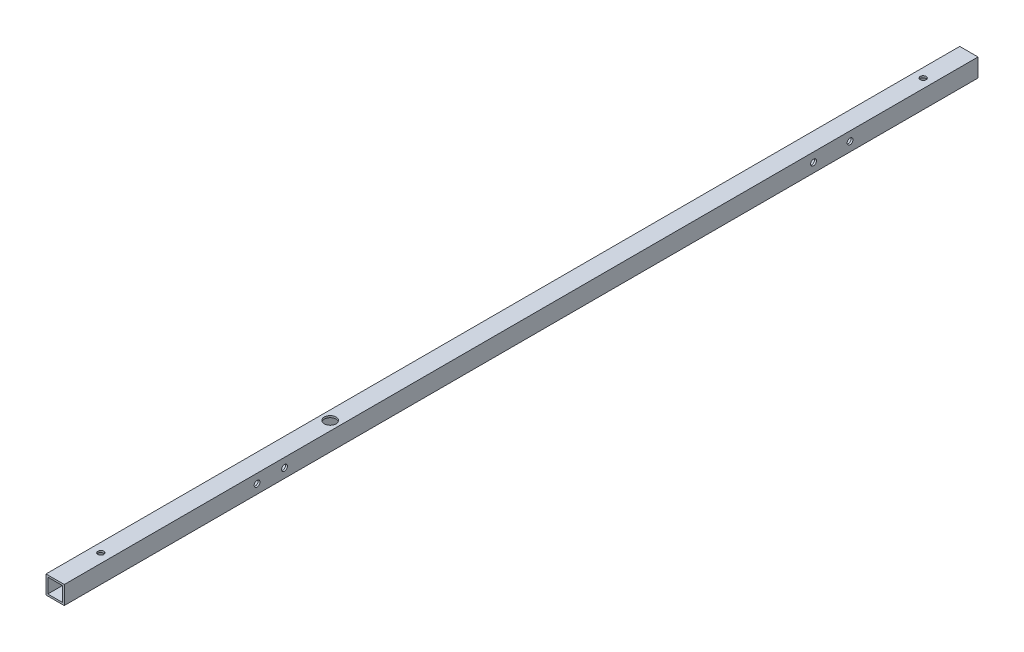
ISO-10303-21;
HEADER;
FILE_DESCRIPTION(('STEP AP214'),'2;1');
FILE_NAME('part.step','',(''),(''),'','','');
FILE_SCHEMA(('AUTOMOTIVE_DESIGN { 1 0 10303 214 1 1 1 1 }'));
ENDSEC;
DATA;
#1=APPLICATION_CONTEXT('core data for automotive mechanical design processes');
#2=APPLICATION_PROTOCOL_DEFINITION('international standard','automotive_design',2000,#1);
#3=PRODUCT_CONTEXT('',#1,'mechanical');
#4=PRODUCT('Part','Part','',(#3));
#5=PRODUCT_RELATED_PRODUCT_CATEGORY('part','',(#4));
#6=PRODUCT_DEFINITION_FORMATION('','',#4);
#7=PRODUCT_DEFINITION_CONTEXT('part definition',#1,'design');
#8=PRODUCT_DEFINITION('design','',#6,#7);
#9=PRODUCT_DEFINITION_SHAPE('','',#8);
#10=(LENGTH_UNIT() NAMED_UNIT(*) SI_UNIT(.MILLI.,.METRE.));
#11=(NAMED_UNIT(*) PLANE_ANGLE_UNIT() SI_UNIT($,.RADIAN.));
#12=(NAMED_UNIT(*) SI_UNIT($,.STERADIAN.) SOLID_ANGLE_UNIT());
#13=UNCERTAINTY_MEASURE_WITH_UNIT(LENGTH_MEASURE(1.E-05),#10,'distance_accuracy_value','');
#14=(GEOMETRIC_REPRESENTATION_CONTEXT(3) GLOBAL_UNCERTAINTY_ASSIGNED_CONTEXT((#13)) GLOBAL_UNIT_ASSIGNED_CONTEXT((#10,
#11,#12)) REPRESENTATION_CONTEXT('',''));
#15=CARTESIAN_POINT('',(0.,0.,0.));
#16=DIRECTION('',(0.,0.,1.));
#17=DIRECTION('',(1.,0.,0.));
#18=AXIS2_PLACEMENT_3D('',#15,#16,#17);
#19=CARTESIAN_POINT('',(0.,0.,500.));
#20=DIRECTION('',(0.,0.,1.));
#21=DIRECTION('',(1.,0.,0.));
#22=AXIS2_PLACEMENT_3D('',#19,#20,#21);
#23=PLANE('',#22);
#24=DIRECTION('',(0.,1.,0.));
#25=VECTOR('',#24,1.);
#26=CARTESIAN_POINT('',(5.,5.,500.));
#27=LINE('',#26,#25);
#28=CARTESIAN_POINT('',(5.,-5.,500.));
#29=VERTEX_POINT('',#28);
#30=CARTESIAN_POINT('',(5.,5.,500.));
#31=VERTEX_POINT('',#30);
#32=EDGE_CURVE('E138',#29,#31,#27,.T.);
#33=ORIENTED_EDGE('',*,*,#32,.T.);
#34=DIRECTION('',(-1.,0.,0.));
#35=VECTOR('',#34,1.);
#36=CARTESIAN_POINT('',(-5.,5.,500.));
#37=LINE('',#36,#35);
#38=CARTESIAN_POINT('',(-5.,5.,500.));
#39=VERTEX_POINT('',#38);
#40=EDGE_CURVE('E141',#31,#39,#37,.T.);
#41=ORIENTED_EDGE('',*,*,#40,.T.);
#42=DIRECTION('',(0.,-1.,0.));
#43=VECTOR('',#42,1.);
#44=CARTESIAN_POINT('',(-5.,5.,500.));
#45=LINE('',#44,#43);
#46=CARTESIAN_POINT('',(-5.,-5.,500.));
#47=VERTEX_POINT('',#46);
#48=EDGE_CURVE('E144',#39,#47,#45,.T.);
#49=ORIENTED_EDGE('',*,*,#48,.T.);
#50=DIRECTION('',(1.,0.,0.));
#51=VECTOR('',#50,1.);
#52=CARTESIAN_POINT('',(-5.,-5.,500.));
#53=LINE('',#52,#51);
#54=EDGE_CURVE('E146',#47,#29,#53,.T.);
#55=ORIENTED_EDGE('',*,*,#54,.T.);
#56=EDGE_LOOP('',(#33,#41,#49,#55));
#57=FACE_BOUND('',#56,.T.);
#58=DIRECTION('',(-1.,0.,0.));
#59=VECTOR('',#58,1.);
#60=CARTESIAN_POINT('',(-4.,4.,500.));
#61=LINE('',#60,#59);
#62=CARTESIAN_POINT('',(4.,4.,500.));
#63=VERTEX_POINT('',#62);
#64=CARTESIAN_POINT('',(-4.,4.,500.));
#65=VERTEX_POINT('',#64);
#66=EDGE_CURVE('E108',#63,#65,#61,.T.);
#67=ORIENTED_EDGE('',*,*,#66,.F.);
#68=DIRECTION('',(0.,1.,0.));
#69=VECTOR('',#68,1.);
#70=CARTESIAN_POINT('',(4.,4.,500.));
#71=LINE('',#70,#69);
#72=CARTESIAN_POINT('',(4.,-4.,500.));
#73=VERTEX_POINT('',#72);
#74=EDGE_CURVE('E100',#73,#63,#71,.T.);
#75=ORIENTED_EDGE('',*,*,#74,.F.);
#76=DIRECTION('',(1.,0.,0.));
#77=VECTOR('',#76,1.);
#78=CARTESIAN_POINT('',(-4.,-4.,500.));
#79=LINE('',#78,#77);
#80=CARTESIAN_POINT('',(-4.,-4.,500.));
#81=VERTEX_POINT('',#80);
#82=EDGE_CURVE('E122',#81,#73,#79,.T.);
#83=ORIENTED_EDGE('',*,*,#82,.F.);
#84=DIRECTION('',(0.,-1.,0.));
#85=VECTOR('',#84,1.);
#86=CARTESIAN_POINT('',(-4.,4.,500.));
#87=LINE('',#86,#85);
#88=EDGE_CURVE('E120',#65,#81,#87,.T.);
#89=ORIENTED_EDGE('',*,*,#88,.F.);
#90=EDGE_LOOP('',(#67,#75,#83,#89));
#91=FACE_BOUND('',#90,.T.);
#92=ADVANCED_FACE('F33',(#57,#91),#23,.T.);
#93=CARTESIAN_POINT('',(0.,0.,0.));
#94=DIRECTION('',(0.,0.,1.));
#95=DIRECTION('',(1.,0.,0.));
#96=AXIS2_PLACEMENT_3D('',#93,#94,#95);
#97=PLANE('',#96);
#98=DIRECTION('',(0.,1.,0.));
#99=VECTOR('',#98,1.);
#100=CARTESIAN_POINT('',(5.,5.,0.));
#101=LINE('',#100,#99);
#102=CARTESIAN_POINT('',(5.,-5.,0.));
#103=VERTEX_POINT('',#102);
#104=CARTESIAN_POINT('',(5.,5.,0.));
#105=VERTEX_POINT('',#104);
#106=EDGE_CURVE('E116',#103,#105,#101,.T.);
#107=ORIENTED_EDGE('',*,*,#106,.F.);
#108=DIRECTION('',(1.,0.,0.));
#109=VECTOR('',#108,1.);
#110=CARTESIAN_POINT('',(-5.,-5.,0.));
#111=LINE('',#110,#109);
#112=CARTESIAN_POINT('',(-5.,-5.,0.));
#113=VERTEX_POINT('',#112);
#114=EDGE_CURVE('E142',#113,#103,#111,.T.);
#115=ORIENTED_EDGE('',*,*,#114,.F.);
#116=DIRECTION('',(0.,-1.,0.));
#117=VECTOR('',#116,1.);
#118=CARTESIAN_POINT('',(-5.,5.,0.));
#119=LINE('',#118,#117);
#120=CARTESIAN_POINT('',(-5.,5.,0.));
#121=VERTEX_POINT('',#120);
#122=EDGE_CURVE('E153',#121,#113,#119,.T.);
#123=ORIENTED_EDGE('',*,*,#122,.F.);
#124=DIRECTION('',(-1.,0.,0.));
#125=VECTOR('',#124,1.);
#126=CARTESIAN_POINT('',(-5.,5.,0.));
#127=LINE('',#126,#125);
#128=EDGE_CURVE('E151',#105,#121,#127,.T.);
#129=ORIENTED_EDGE('',*,*,#128,.F.);
#130=EDGE_LOOP('',(#107,#115,#123,#129));
#131=FACE_BOUND('',#130,.T.);
#132=DIRECTION('',(0.,1.,0.));
#133=VECTOR('',#132,1.);
#134=CARTESIAN_POINT('',(4.,4.,0.));
#135=LINE('',#134,#133);
#136=CARTESIAN_POINT('',(4.,-4.,0.));
#137=VERTEX_POINT('',#136);
#138=CARTESIAN_POINT('',(4.,4.,0.));
#139=VERTEX_POINT('',#138);
#140=EDGE_CURVE('E58',#137,#139,#135,.T.);
#141=ORIENTED_EDGE('',*,*,#140,.T.);
#142=DIRECTION('',(-1.,0.,0.));
#143=VECTOR('',#142,1.);
#144=CARTESIAN_POINT('',(-4.,4.,0.));
#145=LINE('',#144,#143);
#146=CARTESIAN_POINT('',(-4.,4.,0.));
#147=VERTEX_POINT('',#146);
#148=EDGE_CURVE('E115',#139,#147,#145,.T.);
#149=ORIENTED_EDGE('',*,*,#148,.T.);
#150=DIRECTION('',(0.,-1.,0.));
#151=VECTOR('',#150,1.);
#152=CARTESIAN_POINT('',(-4.,4.,0.));
#153=LINE('',#152,#151);
#154=CARTESIAN_POINT('',(-4.,-4.,0.));
#155=VERTEX_POINT('',#154);
#156=EDGE_CURVE('E130',#147,#155,#153,.T.);
#157=ORIENTED_EDGE('',*,*,#156,.T.);
#158=DIRECTION('',(1.,0.,0.));
#159=VECTOR('',#158,1.);
#160=CARTESIAN_POINT('',(-4.,-4.,0.));
#161=LINE('',#160,#159);
#162=EDGE_CURVE('E109',#155,#137,#161,.T.);
#163=ORIENTED_EDGE('',*,*,#162,.T.);
#164=EDGE_LOOP('',(#141,#149,#157,#163));
#165=FACE_BOUND('',#164,.T.);
#166=ADVANCED_FACE('F235',(#131,#165),#97,.F.);
#167=CARTESIAN_POINT('',(5.,5.,500.));
#168=DIRECTION('',(-1.,0.,0.));
#169=DIRECTION('',(0.,-1.,0.));
#170=AXIS2_PLACEMENT_3D('',#167,#168,#169);
#171=PLANE('',#170);
#172=CARTESIAN_POINT('',(5.,0.,70.));
#173=DIRECTION('',(1.,0.,0.));
#174=DIRECTION('',(0.,1.,0.));
#175=AXIS2_PLACEMENT_3D('',#172,#173,#174);
#176=CIRCLE('',#175,1.60000000000001);
#177=CARTESIAN_POINT('',(5.,1.60000000000001,70.));
#178=VERTEX_POINT('',#177);
#179=EDGE_CURVE('E324',#178,#178,#176,.T.);
#180=ORIENTED_EDGE('',*,*,#179,.F.);
#181=EDGE_LOOP('',(#180));
#182=FACE_BOUND('',#181,.T.);
#183=CARTESIAN_POINT('',(5.,0.,379.5));
#184=DIRECTION('',(1.,0.,0.));
#185=DIRECTION('',(0.,1.,0.));
#186=AXIS2_PLACEMENT_3D('',#183,#184,#185);
#187=CIRCLE('',#186,1.59999999999996);
#188=CARTESIAN_POINT('',(5.,1.59999999999997,379.5));
#189=VERTEX_POINT('',#188);
#190=EDGE_CURVE('E320',#189,#189,#187,.T.);
#191=ORIENTED_EDGE('',*,*,#190,.F.);
#192=EDGE_LOOP('',(#191));
#193=FACE_BOUND('',#192,.T.);
#194=CARTESIAN_POINT('',(5.,0.,394.5));
#195=DIRECTION('',(1.,0.,0.));
#196=DIRECTION('',(0.,1.,0.));
#197=AXIS2_PLACEMENT_3D('',#194,#195,#196);
#198=CIRCLE('',#197,1.59999999999996);
#199=CARTESIAN_POINT('',(5.,1.59999999999997,394.5));
#200=VERTEX_POINT('',#199);
#201=EDGE_CURVE('E331',#200,#200,#198,.T.);
#202=ORIENTED_EDGE('',*,*,#201,.F.);
#203=EDGE_LOOP('',(#202));
#204=FACE_BOUND('',#203,.T.);
#205=CARTESIAN_POINT('',(5.,0.,90.));
#206=DIRECTION('',(1.,0.,0.));
#207=DIRECTION('',(0.,1.,0.));
#208=AXIS2_PLACEMENT_3D('',#205,#206,#207);
#209=CIRCLE('',#208,1.60000000000001);
#210=CARTESIAN_POINT('',(5.,1.60000000000001,90.));
#211=VERTEX_POINT('',#210);
#212=EDGE_CURVE('E336',#211,#211,#209,.T.);
#213=ORIENTED_EDGE('',*,*,#212,.F.);
#214=EDGE_LOOP('',(#213));
#215=FACE_BOUND('',#214,.T.);
#216=ORIENTED_EDGE('',*,*,#106,.T.);
#217=DIRECTION('',(0.,0.,-1.));
#218=VECTOR('',#217,1.);
#219=CARTESIAN_POINT('',(5.,5.,500.));
#220=LINE('',#219,#218);
#221=EDGE_CURVE('E11',#31,#105,#220,.T.);
#222=ORIENTED_EDGE('',*,*,#221,.F.);
#223=ORIENTED_EDGE('',*,*,#32,.F.);
#224=DIRECTION('',(0.,0.,-1.));
#225=VECTOR('',#224,1.);
#226=CARTESIAN_POINT('',(5.,-5.,500.));
#227=LINE('',#226,#225);
#228=EDGE_CURVE('E148',#29,#103,#227,.T.);
#229=ORIENTED_EDGE('',*,*,#228,.T.);
#230=EDGE_LOOP('',(#216,#222,#223,#229));
#231=FACE_BOUND('',#230,.T.);
#232=ADVANCED_FACE('F35',(#182,#193,#204,#215,#231),#171,.F.);
#233=CARTESIAN_POINT('',(-5.,5.,500.));
#234=DIRECTION('',(0.,-1.,0.));
#235=DIRECTION('',(0.,0.,-1.));
#236=AXIS2_PLACEMENT_3D('',#233,#234,#235);
#237=PLANE('',#236);
#238=CARTESIAN_POINT('',(0.,5.,349.5));
#239=DIRECTION('',(0.,1.,0.));
#240=DIRECTION('',(0.,0.,1.));
#241=AXIS2_PLACEMENT_3D('',#238,#239,#240);
#242=CIRCLE('',#241,3.25);
#243=CARTESIAN_POINT('',(0.,5.,352.75));
#244=VERTEX_POINT('',#243);
#245=EDGE_CURVE('E318',#244,#244,#242,.T.);
#246=ORIENTED_EDGE('',*,*,#245,.F.);
#247=EDGE_LOOP('',(#246));
#248=FACE_BOUND('',#247,.T.);
#249=CARTESIAN_POINT('',(0.,5.,475.));
#250=DIRECTION('',(0.,1.,0.));
#251=DIRECTION('',(0.,0.,1.));
#252=AXIS2_PLACEMENT_3D('',#249,#250,#251);
#253=CIRCLE('',#252,1.59999999999999);
#254=CARTESIAN_POINT('',(0.,5.,476.6));
#255=VERTEX_POINT('',#254);
#256=EDGE_CURVE('E201',#255,#255,#253,.T.);
#257=ORIENTED_EDGE('',*,*,#256,.F.);
#258=EDGE_LOOP('',(#257));
#259=FACE_BOUND('',#258,.T.);
#260=CARTESIAN_POINT('',(0.,5.,25.));
#261=DIRECTION('',(0.,1.,0.));
#262=DIRECTION('',(0.,0.,1.));
#263=AXIS2_PLACEMENT_3D('',#260,#261,#262);
#264=CIRCLE('',#263,1.6);
#265=CARTESIAN_POINT('',(0.,5.,26.6));
#266=VERTEX_POINT('',#265);
#267=EDGE_CURVE('E200',#266,#266,#264,.T.);
#268=ORIENTED_EDGE('',*,*,#267,.F.);
#269=EDGE_LOOP('',(#268));
#270=FACE_BOUND('',#269,.T.);
#271=ORIENTED_EDGE('',*,*,#128,.T.);
#272=DIRECTION('',(0.,0.,-1.));
#273=VECTOR('',#272,1.);
#274=CARTESIAN_POINT('',(-5.,5.,500.));
#275=LINE('',#274,#273);
#276=EDGE_CURVE('E42',#39,#121,#275,.T.);
#277=ORIENTED_EDGE('',*,*,#276,.F.);
#278=ORIENTED_EDGE('',*,*,#40,.F.);
#279=ORIENTED_EDGE('',*,*,#221,.T.);
#280=EDGE_LOOP('',(#271,#277,#278,#279));
#281=FACE_BOUND('',#280,.T.);
#282=ADVANCED_FACE('F239',(#248,#259,#270,#281),#237,.F.);
#283=CARTESIAN_POINT('',(-5.,5.,500.));
#284=DIRECTION('',(1.,0.,0.));
#285=DIRECTION('',(0.,1.,0.));
#286=AXIS2_PLACEMENT_3D('',#283,#284,#285);
#287=PLANE('',#286);
#288=CARTESIAN_POINT('',(-5.,0.,70.));
#289=DIRECTION('',(1.,0.,0.));
#290=DIRECTION('',(0.,1.,0.));
#291=AXIS2_PLACEMENT_3D('',#288,#289,#290);
#292=CIRCLE('',#291,1.60000000000001);
#293=CARTESIAN_POINT('',(-5.,1.6,70.));
#294=VERTEX_POINT('',#293);
#295=EDGE_CURVE('E179',#294,#294,#292,.T.);
#296=ORIENTED_EDGE('',*,*,#295,.T.);
#297=EDGE_LOOP('',(#296));
#298=FACE_BOUND('',#297,.T.);
#299=CARTESIAN_POINT('',(-5.,0.,379.5));
#300=DIRECTION('',(1.,0.,0.));
#301=DIRECTION('',(0.,1.,0.));
#302=AXIS2_PLACEMENT_3D('',#299,#300,#301);
#303=CIRCLE('',#302,1.59999999999996);
#304=CARTESIAN_POINT('',(-5.,1.59999999999996,379.5));
#305=VERTEX_POINT('',#304);
#306=EDGE_CURVE('E328',#305,#305,#303,.T.);
#307=ORIENTED_EDGE('',*,*,#306,.T.);
#308=EDGE_LOOP('',(#307));
#309=FACE_BOUND('',#308,.T.);
#310=CARTESIAN_POINT('',(-5.,0.,394.5));
#311=DIRECTION('',(1.,0.,0.));
#312=DIRECTION('',(0.,1.,0.));
#313=AXIS2_PLACEMENT_3D('',#310,#311,#312);
#314=CIRCLE('',#313,1.59999999999996);
#315=CARTESIAN_POINT('',(-5.,1.59999999999996,394.5));
#316=VERTEX_POINT('',#315);
#317=EDGE_CURVE('E339',#316,#316,#314,.T.);
#318=ORIENTED_EDGE('',*,*,#317,.T.);
#319=EDGE_LOOP('',(#318));
#320=FACE_BOUND('',#319,.T.);
#321=CARTESIAN_POINT('',(-5.,0.,90.));
#322=DIRECTION('',(1.,0.,0.));
#323=DIRECTION('',(0.,1.,0.));
#324=AXIS2_PLACEMENT_3D('',#321,#322,#323);
#325=CIRCLE('',#324,1.60000000000001);
#326=CARTESIAN_POINT('',(-5.,1.6,90.));
#327=VERTEX_POINT('',#326);
#328=EDGE_CURVE('E327',#327,#327,#325,.T.);
#329=ORIENTED_EDGE('',*,*,#328,.T.);
#330=EDGE_LOOP('',(#329));
#331=FACE_BOUND('',#330,.T.);
#332=ORIENTED_EDGE('',*,*,#122,.T.);
#333=DIRECTION('',(0.,0.,-1.));
#334=VECTOR('',#333,1.);
#335=CARTESIAN_POINT('',(-5.,-5.,500.));
#336=LINE('',#335,#334);
#337=EDGE_CURVE('E158',#47,#113,#336,.T.);
#338=ORIENTED_EDGE('',*,*,#337,.F.);
#339=ORIENTED_EDGE('',*,*,#48,.F.);
#340=ORIENTED_EDGE('',*,*,#276,.T.);
#341=EDGE_LOOP('',(#332,#338,#339,#340));
#342=FACE_BOUND('',#341,.T.);
#343=ADVANCED_FACE('F222',(#298,#309,#320,#331,#342),#287,.F.);
#344=CARTESIAN_POINT('',(-5.,-5.,500.));
#345=DIRECTION('',(0.,1.,0.));
#346=DIRECTION('',(0.,0.,1.));
#347=AXIS2_PLACEMENT_3D('',#344,#345,#346);
#348=PLANE('',#347);
#349=CARTESIAN_POINT('',(0.,-5.,475.));
#350=DIRECTION('',(0.,1.,0.));
#351=DIRECTION('',(0.,0.,1.));
#352=AXIS2_PLACEMENT_3D('',#349,#350,#351);
#353=CIRCLE('',#352,1.59999999999999);
#354=CARTESIAN_POINT('',(0.,-5.,476.6));
#355=VERTEX_POINT('',#354);
#356=EDGE_CURVE('E170',#355,#355,#353,.F.);
#357=ORIENTED_EDGE('',*,*,#356,.F.);
#358=EDGE_LOOP('',(#357));
#359=FACE_BOUND('',#358,.T.);
#360=CARTESIAN_POINT('',(0.,-5.,25.));
#361=DIRECTION('',(0.,1.,0.));
#362=DIRECTION('',(0.,0.,1.));
#363=AXIS2_PLACEMENT_3D('',#360,#361,#362);
#364=CIRCLE('',#363,1.6);
#365=CARTESIAN_POINT('',(0.,-5.,26.6));
#366=VERTEX_POINT('',#365);
#367=EDGE_CURVE('E204',#366,#366,#364,.F.);
#368=ORIENTED_EDGE('',*,*,#367,.F.);
#369=EDGE_LOOP('',(#368));
#370=FACE_BOUND('',#369,.T.);
#371=CARTESIAN_POINT('',(0.,-5.,349.5));
#372=DIRECTION('',(0.,1.,0.));
#373=DIRECTION('',(0.,0.,1.));
#374=AXIS2_PLACEMENT_3D('',#371,#372,#373);
#375=CIRCLE('',#374,1.59999999999999);
#376=CARTESIAN_POINT('',(0.,-5.,351.1));
#377=VERTEX_POINT('',#376);
#378=EDGE_CURVE('E165',#377,#377,#375,.F.);
#379=ORIENTED_EDGE('',*,*,#378,.F.);
#380=EDGE_LOOP('',(#379));
#381=FACE_BOUND('',#380,.T.);
#382=ORIENTED_EDGE('',*,*,#114,.T.);
#383=ORIENTED_EDGE('',*,*,#228,.F.);
#384=ORIENTED_EDGE('',*,*,#54,.F.);
#385=ORIENTED_EDGE('',*,*,#337,.T.);
#386=EDGE_LOOP('',(#382,#383,#384,#385));
#387=FACE_BOUND('',#386,.T.);
#388=ADVANCED_FACE('F219',(#359,#370,#381,#387),#348,.F.);
#389=CARTESIAN_POINT('',(4.,4.,500.));
#390=DIRECTION('',(-1.,0.,0.));
#391=DIRECTION('',(0.,-1.,0.));
#392=AXIS2_PLACEMENT_3D('',#389,#390,#391);
#393=PLANE('',#392);
#394=CARTESIAN_POINT('',(4.,0.,70.));
#395=DIRECTION('',(-1.,0.,0.));
#396=DIRECTION('',(0.,-1.,0.));
#397=AXIS2_PLACEMENT_3D('',#394,#395,#396);
#398=CIRCLE('',#397,1.60000000000001);
#399=CARTESIAN_POINT('',(4.,-1.6,70.));
#400=VERTEX_POINT('',#399);
#401=EDGE_CURVE('E197',#400,#400,#398,.T.);
#402=ORIENTED_EDGE('',*,*,#401,.F.);
#403=EDGE_LOOP('',(#402));
#404=FACE_BOUND('',#403,.T.);
#405=CARTESIAN_POINT('',(4.,0.,379.5));
#406=DIRECTION('',(-1.,0.,0.));
#407=DIRECTION('',(0.,-1.,0.));
#408=AXIS2_PLACEMENT_3D('',#405,#406,#407);
#409=CIRCLE('',#408,1.59999999999996);
#410=CARTESIAN_POINT('',(4.,-1.59999999999996,379.5));
#411=VERTEX_POINT('',#410);
#412=EDGE_CURVE('E185',#411,#411,#409,.T.);
#413=ORIENTED_EDGE('',*,*,#412,.F.);
#414=EDGE_LOOP('',(#413));
#415=FACE_BOUND('',#414,.T.);
#416=CARTESIAN_POINT('',(4.,0.,394.5));
#417=DIRECTION('',(-1.,0.,0.));
#418=DIRECTION('',(0.,-1.,0.));
#419=AXIS2_PLACEMENT_3D('',#416,#417,#418);
#420=CIRCLE('',#419,1.59999999999996);
#421=CARTESIAN_POINT('',(4.,-1.59999999999996,394.5));
#422=VERTEX_POINT('',#421);
#423=EDGE_CURVE('E182',#422,#422,#420,.T.);
#424=ORIENTED_EDGE('',*,*,#423,.F.);
#425=EDGE_LOOP('',(#424));
#426=FACE_BOUND('',#425,.T.);
#427=CARTESIAN_POINT('',(4.,0.,90.));
#428=DIRECTION('',(-1.,0.,0.));
#429=DIRECTION('',(0.,-1.,0.));
#430=AXIS2_PLACEMENT_3D('',#427,#428,#429);
#431=CIRCLE('',#430,1.60000000000001);
#432=CARTESIAN_POINT('',(4.,-1.6,90.));
#433=VERTEX_POINT('',#432);
#434=EDGE_CURVE('E178',#433,#433,#431,.T.);
#435=ORIENTED_EDGE('',*,*,#434,.F.);
#436=EDGE_LOOP('',(#435));
#437=FACE_BOUND('',#436,.T.);
#438=ORIENTED_EDGE('',*,*,#140,.F.);
#439=DIRECTION('',(0.,0.,-1.));
#440=VECTOR('',#439,1.);
#441=CARTESIAN_POINT('',(4.,-4.,500.));
#442=LINE('',#441,#440);
#443=EDGE_CURVE('E104',#73,#137,#442,.T.);
#444=ORIENTED_EDGE('',*,*,#443,.F.);
#445=ORIENTED_EDGE('',*,*,#74,.T.);
#446=DIRECTION('',(0.,0.,-1.));
#447=VECTOR('',#446,1.);
#448=CARTESIAN_POINT('',(4.,4.,500.));
#449=LINE('',#448,#447);
#450=EDGE_CURVE('E103',#63,#139,#449,.T.);
#451=ORIENTED_EDGE('',*,*,#450,.T.);
#452=EDGE_LOOP('',(#438,#444,#445,#451));
#453=FACE_BOUND('',#452,.T.);
#454=ADVANCED_FACE('F102',(#404,#415,#426,#437,#453),#393,.T.);
#455=CARTESIAN_POINT('',(-4.,4.,500.));
#456=DIRECTION('',(0.,-1.,0.));
#457=DIRECTION('',(0.,0.,-1.));
#458=AXIS2_PLACEMENT_3D('',#455,#456,#457);
#459=PLANE('',#458);
#460=CARTESIAN_POINT('',(0.,4.,349.5));
#461=DIRECTION('',(0.,1.,0.));
#462=DIRECTION('',(0.,0.,1.));
#463=AXIS2_PLACEMENT_3D('',#460,#461,#462);
#464=CIRCLE('',#463,3.25);
#465=CARTESIAN_POINT('',(0.,4.,352.75));
#466=VERTEX_POINT('',#465);
#467=EDGE_CURVE('E315',#466,#466,#464,.T.);
#468=ORIENTED_EDGE('',*,*,#467,.T.);
#469=EDGE_LOOP('',(#468));
#470=FACE_BOUND('',#469,.T.);
#471=CARTESIAN_POINT('',(0.,4.,475.));
#472=DIRECTION('',(0.,-1.,0.));
#473=DIRECTION('',(0.,0.,-1.));
#474=AXIS2_PLACEMENT_3D('',#471,#472,#473);
#475=CIRCLE('',#474,1.59999999999999);
#476=CARTESIAN_POINT('',(0.,4.,473.4));
#477=VERTEX_POINT('',#476);
#478=EDGE_CURVE('E174',#477,#477,#475,.T.);
#479=ORIENTED_EDGE('',*,*,#478,.F.);
#480=EDGE_LOOP('',(#479));
#481=FACE_BOUND('',#480,.T.);
#482=CARTESIAN_POINT('',(0.,4.,25.));
#483=DIRECTION('',(0.,-1.,0.));
#484=DIRECTION('',(0.,0.,-1.));
#485=AXIS2_PLACEMENT_3D('',#482,#483,#484);
#486=CIRCLE('',#485,1.6);
#487=CARTESIAN_POINT('',(0.,4.,23.4));
#488=VERTEX_POINT('',#487);
#489=EDGE_CURVE('E169',#488,#488,#486,.T.);
#490=ORIENTED_EDGE('',*,*,#489,.F.);
#491=EDGE_LOOP('',(#490));
#492=FACE_BOUND('',#491,.T.);
#493=ORIENTED_EDGE('',*,*,#148,.F.);
#494=ORIENTED_EDGE('',*,*,#450,.F.);
#495=ORIENTED_EDGE('',*,*,#66,.T.);
#496=DIRECTION('',(0.,0.,-1.));
#497=VECTOR('',#496,1.);
#498=CARTESIAN_POINT('',(-4.,4.,500.));
#499=LINE('',#498,#497);
#500=EDGE_CURVE('E117',#65,#147,#499,.T.);
#501=ORIENTED_EDGE('',*,*,#500,.T.);
#502=EDGE_LOOP('',(#493,#494,#495,#501));
#503=FACE_BOUND('',#502,.T.);
#504=ADVANCED_FACE('F112',(#470,#481,#492,#503),#459,.T.);
#505=CARTESIAN_POINT('',(-4.,4.,500.));
#506=DIRECTION('',(1.,0.,0.));
#507=DIRECTION('',(0.,1.,0.));
#508=AXIS2_PLACEMENT_3D('',#505,#506,#507);
#509=PLANE('',#508);
#510=CARTESIAN_POINT('',(-4.,0.,70.));
#511=DIRECTION('',(1.,0.,0.));
#512=DIRECTION('',(0.,1.,0.));
#513=AXIS2_PLACEMENT_3D('',#510,#511,#512);
#514=CIRCLE('',#513,1.60000000000001);
#515=CARTESIAN_POINT('',(-4.,1.6,70.));
#516=VERTEX_POINT('',#515);
#517=EDGE_CURVE('E37',#516,#516,#514,.T.);
#518=ORIENTED_EDGE('',*,*,#517,.F.);
#519=EDGE_LOOP('',(#518));
#520=FACE_BOUND('',#519,.T.);
#521=CARTESIAN_POINT('',(-4.,0.,379.5));
#522=DIRECTION('',(1.,0.,0.));
#523=DIRECTION('',(0.,1.,0.));
#524=AXIS2_PLACEMENT_3D('',#521,#522,#523);
#525=CIRCLE('',#524,1.59999999999996);
#526=CARTESIAN_POINT('',(-4.,1.59999999999996,379.5));
#527=VERTEX_POINT('',#526);
#528=EDGE_CURVE('E183',#527,#527,#525,.T.);
#529=ORIENTED_EDGE('',*,*,#528,.F.);
#530=EDGE_LOOP('',(#529));
#531=FACE_BOUND('',#530,.T.);
#532=CARTESIAN_POINT('',(-4.,0.,394.5));
#533=DIRECTION('',(1.,0.,0.));
#534=DIRECTION('',(0.,1.,0.));
#535=AXIS2_PLACEMENT_3D('',#532,#533,#534);
#536=CIRCLE('',#535,1.59999999999996);
#537=CARTESIAN_POINT('',(-4.,1.59999999999996,394.5));
#538=VERTEX_POINT('',#537);
#539=EDGE_CURVE('E180',#538,#538,#536,.T.);
#540=ORIENTED_EDGE('',*,*,#539,.F.);
#541=EDGE_LOOP('',(#540));
#542=FACE_BOUND('',#541,.T.);
#543=CARTESIAN_POINT('',(-4.,0.,90.));
#544=DIRECTION('',(1.,0.,0.));
#545=DIRECTION('',(0.,1.,0.));
#546=AXIS2_PLACEMENT_3D('',#543,#544,#545);
#547=CIRCLE('',#546,1.60000000000001);
#548=CARTESIAN_POINT('',(-4.,1.6,90.));
#549=VERTEX_POINT('',#548);
#550=EDGE_CURVE('E175',#549,#549,#547,.T.);
#551=ORIENTED_EDGE('',*,*,#550,.F.);
#552=EDGE_LOOP('',(#551));
#553=FACE_BOUND('',#552,.T.);
#554=ORIENTED_EDGE('',*,*,#156,.F.);
#555=ORIENTED_EDGE('',*,*,#500,.F.);
#556=ORIENTED_EDGE('',*,*,#88,.T.);
#557=DIRECTION('',(0.,0.,-1.));
#558=VECTOR('',#557,1.);
#559=CARTESIAN_POINT('',(-4.,-4.,500.));
#560=LINE('',#559,#558);
#561=EDGE_CURVE('E50',#81,#155,#560,.T.);
#562=ORIENTED_EDGE('',*,*,#561,.T.);
#563=EDGE_LOOP('',(#554,#555,#556,#562));
#564=FACE_BOUND('',#563,.T.);
#565=ADVANCED_FACE('F264',(#520,#531,#542,#553,#564),#509,.T.);
#566=CARTESIAN_POINT('',(-4.,-4.,500.));
#567=DIRECTION('',(0.,1.,0.));
#568=DIRECTION('',(0.,0.,1.));
#569=AXIS2_PLACEMENT_3D('',#566,#567,#568);
#570=PLANE('',#569);
#571=CARTESIAN_POINT('',(0.,-4.,475.));
#572=DIRECTION('',(0.,1.,0.));
#573=DIRECTION('',(0.,0.,1.));
#574=AXIS2_PLACEMENT_3D('',#571,#572,#573);
#575=CIRCLE('',#574,1.59999999999999);
#576=CARTESIAN_POINT('',(0.,-4.,476.6));
#577=VERTEX_POINT('',#576);
#578=EDGE_CURVE('E171',#577,#577,#575,.T.);
#579=ORIENTED_EDGE('',*,*,#578,.F.);
#580=EDGE_LOOP('',(#579));
#581=FACE_BOUND('',#580,.T.);
#582=CARTESIAN_POINT('',(0.,-4.,25.));
#583=DIRECTION('',(0.,1.,0.));
#584=DIRECTION('',(0.,0.,1.));
#585=AXIS2_PLACEMENT_3D('',#582,#583,#584);
#586=CIRCLE('',#585,1.6);
#587=CARTESIAN_POINT('',(0.,-4.,26.6));
#588=VERTEX_POINT('',#587);
#589=EDGE_CURVE('E166',#588,#588,#586,.T.);
#590=ORIENTED_EDGE('',*,*,#589,.F.);
#591=EDGE_LOOP('',(#590));
#592=FACE_BOUND('',#591,.T.);
#593=CARTESIAN_POINT('',(0.,-4.,349.5));
#594=DIRECTION('',(0.,1.,0.));
#595=DIRECTION('',(0.,0.,1.));
#596=AXIS2_PLACEMENT_3D('',#593,#594,#595);
#597=CIRCLE('',#596,1.59999999999999);
#598=CARTESIAN_POINT('',(0.,-4.,351.1));
#599=VERTEX_POINT('',#598);
#600=EDGE_CURVE('E128',#599,#599,#597,.T.);
#601=ORIENTED_EDGE('',*,*,#600,.F.);
#602=EDGE_LOOP('',(#601));
#603=FACE_BOUND('',#602,.T.);
#604=ORIENTED_EDGE('',*,*,#162,.F.);
#605=ORIENTED_EDGE('',*,*,#561,.F.);
#606=ORIENTED_EDGE('',*,*,#82,.T.);
#607=ORIENTED_EDGE('',*,*,#443,.T.);
#608=EDGE_LOOP('',(#604,#605,#606,#607));
#609=FACE_BOUND('',#608,.T.);
#610=ADVANCED_FACE('F268',(#581,#592,#603,#609),#570,.T.);
#611=CARTESIAN_POINT('',(0.,-9.52548339959388,349.5));
#612=DIRECTION('',(0.,1.,0.));
#613=DIRECTION('',(0.,0.,1.));
#614=AXIS2_PLACEMENT_3D('',#611,#612,#613);
#615=CYLINDRICAL_SURFACE('',#614,1.59999999999999);
#616=ORIENTED_EDGE('',*,*,#600,.T.);
#617=EDGE_LOOP('',(#616));
#618=FACE_BOUND('',#617,.T.);
#619=ORIENTED_EDGE('',*,*,#378,.T.);
#620=EDGE_LOOP('',(#619));
#621=FACE_BOUND('',#620,.T.);
#622=ADVANCED_FACE('F217',(#618,#621),#615,.F.);
#623=CARTESIAN_POINT('',(0.,-9.52548339959391,25.));
#624=DIRECTION('',(0.,1.,0.));
#625=DIRECTION('',(0.,0.,1.));
#626=AXIS2_PLACEMENT_3D('',#623,#624,#625);
#627=CYLINDRICAL_SURFACE('',#626,1.6);
#628=ORIENTED_EDGE('',*,*,#589,.T.);
#629=EDGE_LOOP('',(#628));
#630=FACE_BOUND('',#629,.T.);
#631=ORIENTED_EDGE('',*,*,#367,.T.);
#632=EDGE_LOOP('',(#631));
#633=FACE_BOUND('',#632,.T.);
#634=ADVANCED_FACE('F275',(#630,#633),#627,.F.);
#635=CARTESIAN_POINT('',(0.,-9.52548339959391,475.));
#636=DIRECTION('',(0.,1.,0.));
#637=DIRECTION('',(0.,0.,1.));
#638=AXIS2_PLACEMENT_3D('',#635,#636,#637);
#639=CYLINDRICAL_SURFACE('',#638,1.59999999999999);
#640=ORIENTED_EDGE('',*,*,#578,.T.);
#641=EDGE_LOOP('',(#640));
#642=FACE_BOUND('',#641,.T.);
#643=ORIENTED_EDGE('',*,*,#356,.T.);
#644=EDGE_LOOP('',(#643));
#645=FACE_BOUND('',#644,.T.);
#646=ADVANCED_FACE('F279',(#642,#645),#639,.F.);
#647=ORIENTED_EDGE('',*,*,#489,.T.);
#648=EDGE_LOOP('',(#647));
#649=FACE_BOUND('',#648,.T.);
#650=ORIENTED_EDGE('',*,*,#267,.T.);
#651=EDGE_LOOP('',(#650));
#652=FACE_BOUND('',#651,.T.);
#653=ADVANCED_FACE('F281',(#649,#652),#627,.F.);
#654=ORIENTED_EDGE('',*,*,#478,.T.);
#655=EDGE_LOOP('',(#654));
#656=FACE_BOUND('',#655,.T.);
#657=ORIENTED_EDGE('',*,*,#256,.T.);
#658=EDGE_LOOP('',(#657));
#659=FACE_BOUND('',#658,.T.);
#660=ADVANCED_FACE('F285',(#656,#659),#639,.F.);
#661=CARTESIAN_POINT('',(-5.,0.,90.));
#662=DIRECTION('',(1.,0.,0.));
#663=DIRECTION('',(0.,1.,0.));
#664=AXIS2_PLACEMENT_3D('',#661,#662,#663);
#665=CYLINDRICAL_SURFACE('',#664,1.60000000000001);
#666=ORIENTED_EDGE('',*,*,#550,.T.);
#667=EDGE_LOOP('',(#666));
#668=FACE_BOUND('',#667,.T.);
#669=ORIENTED_EDGE('',*,*,#328,.F.);
#670=EDGE_LOOP('',(#669));
#671=FACE_BOUND('',#670,.T.);
#672=ADVANCED_FACE('F290',(#668,#671),#665,.F.);
#673=CARTESIAN_POINT('',(-5.,0.,394.5));
#674=DIRECTION('',(1.,0.,0.));
#675=DIRECTION('',(0.,1.,0.));
#676=AXIS2_PLACEMENT_3D('',#673,#674,#675);
#677=CYLINDRICAL_SURFACE('',#676,1.59999999999996);
#678=ORIENTED_EDGE('',*,*,#539,.T.);
#679=EDGE_LOOP('',(#678));
#680=FACE_BOUND('',#679,.T.);
#681=ORIENTED_EDGE('',*,*,#317,.F.);
#682=EDGE_LOOP('',(#681));
#683=FACE_BOUND('',#682,.T.);
#684=ADVANCED_FACE('F286',(#680,#683),#677,.F.);
#685=CARTESIAN_POINT('',(-5.,0.,379.5));
#686=DIRECTION('',(1.,0.,0.));
#687=DIRECTION('',(0.,1.,0.));
#688=AXIS2_PLACEMENT_3D('',#685,#686,#687);
#689=CYLINDRICAL_SURFACE('',#688,1.59999999999996);
#690=ORIENTED_EDGE('',*,*,#528,.T.);
#691=EDGE_LOOP('',(#690));
#692=FACE_BOUND('',#691,.T.);
#693=ORIENTED_EDGE('',*,*,#306,.F.);
#694=EDGE_LOOP('',(#693));
#695=FACE_BOUND('',#694,.T.);
#696=ADVANCED_FACE('F289',(#692,#695),#689,.F.);
#697=CARTESIAN_POINT('',(-5.,0.,70.));
#698=DIRECTION('',(1.,0.,0.));
#699=DIRECTION('',(0.,1.,0.));
#700=AXIS2_PLACEMENT_3D('',#697,#698,#699);
#701=CYLINDRICAL_SURFACE('',#700,1.60000000000001);
#702=ORIENTED_EDGE('',*,*,#517,.T.);
#703=EDGE_LOOP('',(#702));
#704=FACE_BOUND('',#703,.T.);
#705=ORIENTED_EDGE('',*,*,#295,.F.);
#706=EDGE_LOOP('',(#705));
#707=FACE_BOUND('',#706,.T.);
#708=ADVANCED_FACE('F299',(#704,#707),#701,.F.);
#709=ORIENTED_EDGE('',*,*,#434,.T.);
#710=EDGE_LOOP('',(#709));
#711=FACE_BOUND('',#710,.T.);
#712=ORIENTED_EDGE('',*,*,#212,.T.);
#713=EDGE_LOOP('',(#712));
#714=FACE_BOUND('',#713,.T.);
#715=ADVANCED_FACE('F296',(#711,#714),#665,.F.);
#716=ORIENTED_EDGE('',*,*,#423,.T.);
#717=EDGE_LOOP('',(#716));
#718=FACE_BOUND('',#717,.T.);
#719=ORIENTED_EDGE('',*,*,#201,.T.);
#720=EDGE_LOOP('',(#719));
#721=FACE_BOUND('',#720,.T.);
#722=ADVANCED_FACE('F292',(#718,#721),#677,.F.);
#723=ORIENTED_EDGE('',*,*,#412,.T.);
#724=EDGE_LOOP('',(#723));
#725=FACE_BOUND('',#724,.T.);
#726=ORIENTED_EDGE('',*,*,#190,.T.);
#727=EDGE_LOOP('',(#726));
#728=FACE_BOUND('',#727,.T.);
#729=ADVANCED_FACE('F300',(#725,#728),#689,.F.);
#730=ORIENTED_EDGE('',*,*,#401,.T.);
#731=EDGE_LOOP('',(#730));
#732=FACE_BOUND('',#731,.T.);
#733=ORIENTED_EDGE('',*,*,#179,.T.);
#734=EDGE_LOOP('',(#733));
#735=FACE_BOUND('',#734,.T.);
#736=ADVANCED_FACE('F304',(#732,#735),#701,.F.);
#737=CARTESIAN_POINT('',(0.,4.,349.5));
#738=DIRECTION('',(0.,1.,0.));
#739=DIRECTION('',(0.,0.,1.));
#740=AXIS2_PLACEMENT_3D('',#737,#738,#739);
#741=CYLINDRICAL_SURFACE('',#740,3.25);
#742=ORIENTED_EDGE('',*,*,#467,.F.);
#743=EDGE_LOOP('',(#742));
#744=FACE_BOUND('',#743,.T.);
#745=ORIENTED_EDGE('',*,*,#245,.T.);
#746=EDGE_LOOP('',(#745));
#747=FACE_BOUND('',#746,.T.);
#748=ADVANCED_FACE('F305',(#744,#747),#741,.F.);
#749=CLOSED_SHELL('',(#92,#166,#232,#282,#343,#388,#454,#504,#565,#610,#622,#634,#646,#653,#660,
#672,#684,#696,#708,#715,#722,#729,#736,#748));
#750=MANIFOLD_SOLID_BREP('B2',#749);
#751=ADVANCED_BREP_SHAPE_REPRESENTATION('',(#18,#750),#14);
#752=SHAPE_DEFINITION_REPRESENTATION(#9,#751);
ENDSEC;
END-ISO-10303-21;
